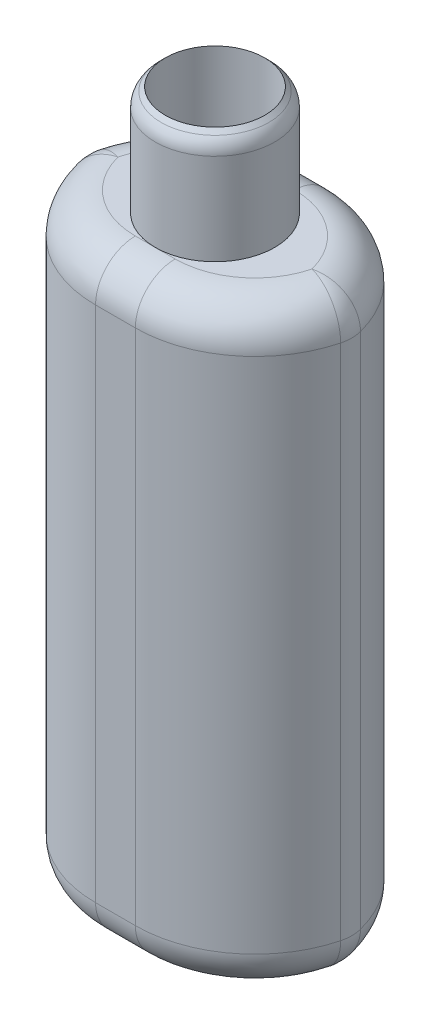
ISO-10303-21;
HEADER;
FILE_DESCRIPTION(('STEP AP214'),'2;1');
FILE_NAME('part.step','',(''),(''),'','','');
FILE_SCHEMA(('AUTOMOTIVE_DESIGN { 1 0 10303 214 1 1 1 1 }'));
ENDSEC;
DATA;
#1=APPLICATION_CONTEXT('core data for automotive mechanical design processes');
#2=APPLICATION_PROTOCOL_DEFINITION('international standard','automotive_design',2000,#1);
#3=PRODUCT_CONTEXT('',#1,'mechanical');
#4=PRODUCT('Part','Part','',(#3));
#5=PRODUCT_RELATED_PRODUCT_CATEGORY('part','',(#4));
#6=PRODUCT_DEFINITION_FORMATION('','',#4);
#7=PRODUCT_DEFINITION_CONTEXT('part definition',#1,'design');
#8=PRODUCT_DEFINITION('design','',#6,#7);
#9=PRODUCT_DEFINITION_SHAPE('','',#8);
#10=(LENGTH_UNIT() NAMED_UNIT(*) SI_UNIT(.MILLI.,.METRE.));
#11=(NAMED_UNIT(*) PLANE_ANGLE_UNIT() SI_UNIT($,.RADIAN.));
#12=(NAMED_UNIT(*) SI_UNIT($,.STERADIAN.) SOLID_ANGLE_UNIT());
#13=UNCERTAINTY_MEASURE_WITH_UNIT(LENGTH_MEASURE(1.E-05),#10,'distance_accuracy_value','');
#14=(GEOMETRIC_REPRESENTATION_CONTEXT(3) GLOBAL_UNCERTAINTY_ASSIGNED_CONTEXT((#13)) GLOBAL_UNIT_ASSIGNED_CONTEXT((#10,
#11,#12)) REPRESENTATION_CONTEXT('',''));
#15=CARTESIAN_POINT('',(0.,0.,0.));
#16=DIRECTION('',(0.,0.,1.));
#17=DIRECTION('',(1.,0.,0.));
#18=AXIS2_PLACEMENT_3D('',#15,#16,#17);
#19=CARTESIAN_POINT('',(-35.,75.,25.));
#20=DIRECTION('',(0.,-1.,0.));
#21=DIRECTION('',(0.,0.,-1.));
#22=AXIS2_PLACEMENT_3D('',#19,#20,#21);
#23=PLANE('',#22);
#24=CARTESIAN_POINT('',(0.,75.,0.));
#25=DIRECTION('',(0.,1.,0.));
#26=DIRECTION('',(0.,0.,1.));
#27=AXIS2_PLACEMENT_3D('',#24,#25,#26);
#28=CIRCLE('',#27,15.);
#29=CARTESIAN_POINT('',(0.,75.,-15.));
#30=VERTEX_POINT('',#29);
#31=CARTESIAN_POINT('',(0.,75.,15.));
#32=VERTEX_POINT('',#31);
#33=EDGE_CURVE('E174',#30,#32,#28,.T.);
#34=ORIENTED_EDGE('',*,*,#33,.F.);
#35=DIRECTION('',(-1.,0.,0.));
#36=VECTOR('',#35,1.);
#37=CARTESIAN_POINT('',(-35.,75.,-15.));
#38=LINE('',#37,#36);
#39=CARTESIAN_POINT('',(-5.00000000000002,75.,-15.));
#40=VERTEX_POINT('',#39);
#41=EDGE_CURVE('E160',#30,#40,#38,.T.);
#42=ORIENTED_EDGE('',*,*,#41,.T.);
#43=CARTESIAN_POINT('',(-5.00000000000002,75.,5.));
#44=DIRECTION('',(0.,-1.,0.));
#45=DIRECTION('',(0.,0.,-1.));
#46=AXIS2_PLACEMENT_3D('',#43,#44,#45);
#47=CIRCLE('',#46,20.);
#48=CARTESIAN_POINT('',(-24.3649167310371,75.,0.));
#49=VERTEX_POINT('',#48);
#50=EDGE_CURVE('E171',#40,#49,#47,.F.);
#51=ORIENTED_EDGE('',*,*,#50,.T.);
#52=CARTESIAN_POINT('',(-5.00000000000002,75.,-5.));
#53=DIRECTION('',(0.,-1.,0.));
#54=DIRECTION('',(0.,0.,-1.));
#55=AXIS2_PLACEMENT_3D('',#52,#53,#54);
#56=CIRCLE('',#55,20.);
#57=CARTESIAN_POINT('',(-5.00000000000002,75.,15.));
#58=VERTEX_POINT('',#57);
#59=EDGE_CURVE('E224',#49,#58,#56,.F.);
#60=ORIENTED_EDGE('',*,*,#59,.T.);
#61=DIRECTION('',(-1.,0.,0.));
#62=VECTOR('',#61,1.);
#63=CARTESIAN_POINT('',(4.99999999999999,75.,15.));
#64=LINE('',#63,#62);
#65=EDGE_CURVE('E176',#58,#32,#64,.F.);
#66=ORIENTED_EDGE('',*,*,#65,.T.);
#67=EDGE_LOOP('',(#34,#42,#51,#60,#66));
#68=FACE_BOUND('',#67,.T.);
#69=ADVANCED_FACE('F43',(#68),#23,.F.);
#70=EDGE_CURVE('E59',#32,#30,#28,.T.);
#71=ORIENTED_EDGE('',*,*,#70,.F.);
#72=CARTESIAN_POINT('',(4.99999999999999,75.,15.));
#73=VERTEX_POINT('',#72);
#74=EDGE_CURVE('E227',#32,#73,#64,.F.);
#75=ORIENTED_EDGE('',*,*,#74,.T.);
#76=CARTESIAN_POINT('',(4.99999999999999,75.,-5.));
#77=DIRECTION('',(0.,-1.,0.));
#78=DIRECTION('',(0.,0.,-1.));
#79=AXIS2_PLACEMENT_3D('',#76,#77,#78);
#80=CIRCLE('',#79,20.);
#81=CARTESIAN_POINT('',(24.3649167310371,75.,0.));
#82=VERTEX_POINT('',#81);
#83=EDGE_CURVE('E230',#73,#82,#80,.F.);
#84=ORIENTED_EDGE('',*,*,#83,.T.);
#85=CARTESIAN_POINT('',(4.99999999999999,75.,5.));
#86=DIRECTION('',(0.,-1.,0.));
#87=DIRECTION('',(0.,0.,-1.));
#88=AXIS2_PLACEMENT_3D('',#85,#86,#87);
#89=CIRCLE('',#88,20.);
#90=CARTESIAN_POINT('',(4.99999999999999,75.,-15.));
#91=VERTEX_POINT('',#90);
#92=EDGE_CURVE('E155',#82,#91,#89,.F.);
#93=ORIENTED_EDGE('',*,*,#92,.T.);
#94=EDGE_CURVE('E150',#91,#30,#38,.T.);
#95=ORIENTED_EDGE('',*,*,#94,.T.);
#96=EDGE_LOOP('',(#71,#75,#84,#93,#95));
#97=FACE_BOUND('',#96,.T.);
#98=ADVANCED_FACE('F152',(#97),#23,.F.);
#99=CARTESIAN_POINT('',(-35.,-75.,25.));
#100=DIRECTION('',(0.,1.,0.));
#101=DIRECTION('',(0.,0.,1.));
#102=AXIS2_PLACEMENT_3D('',#99,#100,#101);
#103=PLANE('',#102);
#104=CARTESIAN_POINT('',(-5.,-75.,-5.));
#105=DIRECTION('',(0.,1.,0.));
#106=DIRECTION('',(0.,0.,1.));
#107=AXIS2_PLACEMENT_3D('',#104,#105,#106);
#108=CIRCLE('',#107,20.);
#109=CARTESIAN_POINT('',(-5.,-75.,15.));
#110=VERTEX_POINT('',#109);
#111=CARTESIAN_POINT('',(-24.3649167310371,-75.,0.));
#112=VERTEX_POINT('',#111);
#113=EDGE_CURVE('E214',#110,#112,#108,.F.);
#114=ORIENTED_EDGE('',*,*,#113,.T.);
#115=CARTESIAN_POINT('',(-5.,-75.,5.));
#116=DIRECTION('',(0.,1.,0.));
#117=DIRECTION('',(0.,0.,1.));
#118=AXIS2_PLACEMENT_3D('',#115,#116,#117);
#119=CIRCLE('',#118,20.);
#120=CARTESIAN_POINT('',(-5.,-75.,-15.));
#121=VERTEX_POINT('',#120);
#122=EDGE_CURVE('E67',#112,#121,#119,.F.);
#123=ORIENTED_EDGE('',*,*,#122,.T.);
#124=DIRECTION('',(1.,0.,0.));
#125=VECTOR('',#124,1.);
#126=CARTESIAN_POINT('',(-35.,-75.,-15.));
#127=LINE('',#126,#125);
#128=CARTESIAN_POINT('',(5.,-75.,-15.));
#129=VERTEX_POINT('',#128);
#130=EDGE_CURVE('E325',#121,#129,#127,.T.);
#131=ORIENTED_EDGE('',*,*,#130,.T.);
#132=CARTESIAN_POINT('',(5.,-75.,5.));
#133=DIRECTION('',(0.,1.,0.));
#134=DIRECTION('',(0.,0.,1.));
#135=AXIS2_PLACEMENT_3D('',#132,#133,#134);
#136=CIRCLE('',#135,20.);
#137=CARTESIAN_POINT('',(24.3649167310371,-75.,0.));
#138=VERTEX_POINT('',#137);
#139=EDGE_CURVE('E322',#129,#138,#136,.F.);
#140=ORIENTED_EDGE('',*,*,#139,.T.);
#141=CARTESIAN_POINT('',(5.,-75.,-5.));
#142=DIRECTION('',(0.,1.,0.));
#143=DIRECTION('',(0.,0.,1.));
#144=AXIS2_PLACEMENT_3D('',#141,#142,#143);
#145=CIRCLE('',#144,20.);
#146=CARTESIAN_POINT('',(5.,-75.,15.));
#147=VERTEX_POINT('',#146);
#148=EDGE_CURVE('E221',#138,#147,#145,.F.);
#149=ORIENTED_EDGE('',*,*,#148,.T.);
#150=DIRECTION('',(1.,0.,0.));
#151=VECTOR('',#150,1.);
#152=CARTESIAN_POINT('',(-5.,-75.,15.));
#153=LINE('',#152,#151);
#154=EDGE_CURVE('E217',#147,#110,#153,.F.);
#155=ORIENTED_EDGE('',*,*,#154,.T.);
#156=EDGE_LOOP('',(#114,#123,#131,#140,#149,#155));
#157=FACE_BOUND('',#156,.T.);
#158=ADVANCED_FACE('F378',(#157),#103,.F.);
#159=CARTESIAN_POINT('',(0.,0.,25.));
#160=DIRECTION('',(0.,0.,1.));
#161=DIRECTION('',(1.,0.,0.));
#162=AXIS2_PLACEMENT_3D('',#159,#160,#161);
#163=PLANE('',#162);
#164=DIRECTION('',(0.,-1.,0.));
#165=VECTOR('',#164,1.);
#166=CARTESIAN_POINT('',(-5.,-75.,25.));
#167=LINE('',#166,#165);
#168=CARTESIAN_POINT('',(-5.00000000000002,65.,25.));
#169=VERTEX_POINT('',#168);
#170=CARTESIAN_POINT('',(-5.,-65.,25.));
#171=VERTEX_POINT('',#170);
#172=EDGE_CURVE('E199',#169,#171,#167,.T.);
#173=ORIENTED_EDGE('',*,*,#172,.T.);
#174=DIRECTION('',(1.,0.,0.));
#175=VECTOR('',#174,1.);
#176=CARTESIAN_POINT('',(5.,-65.,25.));
#177=LINE('',#176,#175);
#178=CARTESIAN_POINT('',(5.,-65.,25.));
#179=VERTEX_POINT('',#178);
#180=EDGE_CURVE('E210',#171,#179,#177,.T.);
#181=ORIENTED_EDGE('',*,*,#180,.T.);
#182=DIRECTION('',(0.,1.,0.));
#183=VECTOR('',#182,1.);
#184=CARTESIAN_POINT('',(4.99999999999999,75.,25.));
#185=LINE('',#184,#183);
#186=CARTESIAN_POINT('',(4.99999999999999,65.,25.));
#187=VERTEX_POINT('',#186);
#188=EDGE_CURVE('E203',#179,#187,#185,.T.);
#189=ORIENTED_EDGE('',*,*,#188,.T.);
#190=DIRECTION('',(-1.,0.,0.));
#191=VECTOR('',#190,1.);
#192=CARTESIAN_POINT('',(-5.00000000000002,65.,25.));
#193=LINE('',#192,#191);
#194=EDGE_CURVE('E207',#187,#169,#193,.T.);
#195=ORIENTED_EDGE('',*,*,#194,.T.);
#196=EDGE_LOOP('',(#173,#181,#189,#195));
#197=FACE_BOUND('',#196,.T.);
#198=ADVANCED_FACE('F506',(#197),#163,.T.);
#199=CARTESIAN_POINT('',(0.,0.,-25.));
#200=DIRECTION('',(0.,0.,1.));
#201=DIRECTION('',(1.,0.,0.));
#202=AXIS2_PLACEMENT_3D('',#199,#200,#201);
#203=PLANE('',#202);
#204=DIRECTION('',(0.,-1.,0.));
#205=VECTOR('',#204,1.);
#206=CARTESIAN_POINT('',(-5.00000000000001,0.,-25.));
#207=LINE('',#206,#205);
#208=CARTESIAN_POINT('',(-5.,-65.,-25.));
#209=VERTEX_POINT('',#208);
#210=CARTESIAN_POINT('',(-5.00000000000002,65.,-25.));
#211=VERTEX_POINT('',#210);
#212=EDGE_CURVE('E194',#209,#211,#207,.F.);
#213=ORIENTED_EDGE('',*,*,#212,.T.);
#214=DIRECTION('',(-1.,0.,0.));
#215=VECTOR('',#214,1.);
#216=CARTESIAN_POINT('',(0.,65.,-25.));
#217=LINE('',#216,#215);
#218=CARTESIAN_POINT('',(4.99999999999999,65.,-25.));
#219=VERTEX_POINT('',#218);
#220=EDGE_CURVE('E313',#211,#219,#217,.F.);
#221=ORIENTED_EDGE('',*,*,#220,.T.);
#222=DIRECTION('',(0.,1.,0.));
#223=VECTOR('',#222,1.);
#224=CARTESIAN_POINT('',(5.,0.,-25.));
#225=LINE('',#224,#223);
#226=CARTESIAN_POINT('',(5.,-65.,-25.));
#227=VERTEX_POINT('',#226);
#228=EDGE_CURVE('E190',#219,#227,#225,.F.);
#229=ORIENTED_EDGE('',*,*,#228,.T.);
#230=DIRECTION('',(1.,0.,0.));
#231=VECTOR('',#230,1.);
#232=CARTESIAN_POINT('',(0.,-65.,-25.));
#233=LINE('',#232,#231);
#234=EDGE_CURVE('E310',#227,#209,#233,.F.);
#235=ORIENTED_EDGE('',*,*,#234,.T.);
#236=EDGE_LOOP('',(#213,#221,#229,#235));
#237=FACE_BOUND('',#236,.T.);
#238=ADVANCED_FACE('F390',(#237),#203,.F.);
#239=CARTESIAN_POINT('',(-5.00000000000001,0.,-5.));
#240=DIRECTION('',(0.,1.,0.));
#241=DIRECTION('',(-1.,0.,0.));
#242=AXIS2_PLACEMENT_3D('',#239,#240,#241);
#243=CYLINDRICAL_SURFACE('',#242,30.);
#244=DIRECTION('',(0.,1.,0.));
#245=VECTOR('',#244,1.);
#246=CARTESIAN_POINT('',(-34.0473750965556,0.,2.5));
#247=LINE('',#246,#245);
#248=CARTESIAN_POINT('',(-34.0473750965556,65.,2.5));
#249=VERTEX_POINT('',#248);
#250=CARTESIAN_POINT('',(-34.0473750965556,-65.,2.5));
#251=VERTEX_POINT('',#250);
#252=EDGE_CURVE('E256',#249,#251,#247,.F.);
#253=ORIENTED_EDGE('',*,*,#252,.T.);
#254=CARTESIAN_POINT('',(-5.,-65.,-5.));
#255=DIRECTION('',(0.,1.,0.));
#256=DIRECTION('',(0.,0.,1.));
#257=AXIS2_PLACEMENT_3D('',#254,#255,#256);
#258=CIRCLE('',#257,30.);
#259=EDGE_CURVE('E260',#251,#171,#258,.T.);
#260=ORIENTED_EDGE('',*,*,#259,.T.);
#261=ORIENTED_EDGE('',*,*,#172,.F.);
#262=CARTESIAN_POINT('',(-5.00000000000002,65.,-5.));
#263=DIRECTION('',(0.,-1.,0.));
#264=DIRECTION('',(0.,0.,-1.));
#265=AXIS2_PLACEMENT_3D('',#262,#263,#264);
#266=CIRCLE('',#265,30.);
#267=EDGE_CURVE('E252',#169,#249,#266,.T.);
#268=ORIENTED_EDGE('',*,*,#267,.T.);
#269=EDGE_LOOP('',(#253,#260,#261,#268));
#270=FACE_BOUND('',#269,.T.);
#271=ADVANCED_FACE('F386',(#270),#243,.T.);
#272=CARTESIAN_POINT('',(-5.00000000000002,75.,5.));
#273=DIRECTION('',(0.,-1.,0.));
#274=DIRECTION('',(1.,0.,0.));
#275=AXIS2_PLACEMENT_3D('',#272,#273,#274);
#276=CYLINDRICAL_SURFACE('',#275,30.);
#277=DIRECTION('',(0.,-1.,0.));
#278=VECTOR('',#277,1.);
#279=CARTESIAN_POINT('',(-34.0473750965556,75.,-2.5));
#280=LINE('',#279,#278);
#281=CARTESIAN_POINT('',(-34.0473750965556,-65.,-2.5));
#282=VERTEX_POINT('',#281);
#283=CARTESIAN_POINT('',(-34.0473750965556,65.,-2.5));
#284=VERTEX_POINT('',#283);
#285=EDGE_CURVE('E248',#282,#284,#280,.F.);
#286=ORIENTED_EDGE('',*,*,#285,.T.);
#287=CARTESIAN_POINT('',(-5.00000000000002,65.,5.));
#288=DIRECTION('',(0.,-1.,0.));
#289=DIRECTION('',(0.,0.,-1.));
#290=AXIS2_PLACEMENT_3D('',#287,#288,#289);
#291=CIRCLE('',#290,30.);
#292=EDGE_CURVE('E307',#284,#211,#291,.T.);
#293=ORIENTED_EDGE('',*,*,#292,.T.);
#294=ORIENTED_EDGE('',*,*,#212,.F.);
#295=CARTESIAN_POINT('',(-5.,-65.,5.));
#296=DIRECTION('',(0.,1.,0.));
#297=DIRECTION('',(0.,0.,1.));
#298=AXIS2_PLACEMENT_3D('',#295,#296,#297);
#299=CIRCLE('',#298,30.);
#300=EDGE_CURVE('E304',#209,#282,#299,.T.);
#301=ORIENTED_EDGE('',*,*,#300,.T.);
#302=EDGE_LOOP('',(#286,#293,#294,#301));
#303=FACE_BOUND('',#302,.T.);
#304=ADVANCED_FACE('F382',(#303),#276,.T.);
#305=CARTESIAN_POINT('',(5.,0.,-5.));
#306=DIRECTION('',(0.,-1.,0.));
#307=DIRECTION('',(1.,0.,0.));
#308=AXIS2_PLACEMENT_3D('',#305,#306,#307);
#309=CYLINDRICAL_SURFACE('',#308,30.);
#310=DIRECTION('',(0.,-1.,0.));
#311=VECTOR('',#310,1.);
#312=CARTESIAN_POINT('',(34.0473750965556,0.,2.5));
#313=LINE('',#312,#311);
#314=CARTESIAN_POINT('',(34.0473750965556,-65.,2.5));
#315=VERTEX_POINT('',#314);
#316=CARTESIAN_POINT('',(34.0473750965556,65.,2.5));
#317=VERTEX_POINT('',#316);
#318=EDGE_CURVE('E241',#315,#317,#313,.F.);
#319=ORIENTED_EDGE('',*,*,#318,.T.);
#320=CARTESIAN_POINT('',(4.99999999999999,65.,-5.));
#321=DIRECTION('',(0.,-1.,0.));
#322=DIRECTION('',(0.,0.,-1.));
#323=AXIS2_PLACEMENT_3D('',#320,#321,#322);
#324=CIRCLE('',#323,30.);
#325=EDGE_CURVE('E245',#317,#187,#324,.T.);
#326=ORIENTED_EDGE('',*,*,#325,.T.);
#327=ORIENTED_EDGE('',*,*,#188,.F.);
#328=CARTESIAN_POINT('',(5.,-65.,-5.));
#329=DIRECTION('',(0.,1.,0.));
#330=DIRECTION('',(0.,0.,1.));
#331=AXIS2_PLACEMENT_3D('',#328,#329,#330);
#332=CIRCLE('',#331,30.);
#333=EDGE_CURVE('E237',#179,#315,#332,.T.);
#334=ORIENTED_EDGE('',*,*,#333,.T.);
#335=EDGE_LOOP('',(#319,#326,#327,#334));
#336=FACE_BOUND('',#335,.T.);
#337=ADVANCED_FACE('F385',(#336),#309,.T.);
#338=CARTESIAN_POINT('',(4.99999999999999,75.,5.));
#339=DIRECTION('',(0.,1.,0.));
#340=DIRECTION('',(-1.,0.,0.));
#341=AXIS2_PLACEMENT_3D('',#338,#339,#340);
#342=CYLINDRICAL_SURFACE('',#341,30.);
#343=ORIENTED_EDGE('',*,*,#228,.F.);
#344=CARTESIAN_POINT('',(4.99999999999999,65.,5.));
#345=DIRECTION('',(0.,-1.,0.));
#346=DIRECTION('',(0.,0.,-1.));
#347=AXIS2_PLACEMENT_3D('',#344,#345,#346);
#348=CIRCLE('',#347,30.);
#349=CARTESIAN_POINT('',(34.0473750965556,65.,-2.5));
#350=VERTEX_POINT('',#349);
#351=EDGE_CURVE('E319',#219,#350,#348,.T.);
#352=ORIENTED_EDGE('',*,*,#351,.T.);
#353=DIRECTION('',(0.,1.,0.));
#354=VECTOR('',#353,1.);
#355=CARTESIAN_POINT('',(34.0473750965556,75.,-2.5));
#356=LINE('',#355,#354);
#357=CARTESIAN_POINT('',(34.0473750965556,-65.,-2.5));
#358=VERTEX_POINT('',#357);
#359=EDGE_CURVE('E233',#350,#358,#356,.F.);
#360=ORIENTED_EDGE('',*,*,#359,.T.);
#361=CARTESIAN_POINT('',(5.,-65.,5.));
#362=DIRECTION('',(0.,1.,0.));
#363=DIRECTION('',(0.,0.,1.));
#364=AXIS2_PLACEMENT_3D('',#361,#362,#363);
#365=CIRCLE('',#364,30.);
#366=EDGE_CURVE('E316',#358,#227,#365,.T.);
#367=ORIENTED_EDGE('',*,*,#366,.T.);
#368=EDGE_LOOP('',(#343,#352,#360,#367));
#369=FACE_BOUND('',#368,.T.);
#370=ADVANCED_FACE('F392',(#369),#342,.T.);
#371=CARTESIAN_POINT('',(0.,65.,15.));
#372=DIRECTION('',(1.,0.,0.));
#373=DIRECTION('',(0.,0.,-1.));
#374=AXIS2_PLACEMENT_3D('',#371,#372,#373);
#375=CYLINDRICAL_SURFACE('',#374,10.);
#376=CARTESIAN_POINT('',(4.99999999999999,65.,15.));
#377=DIRECTION('',(1.,0.,0.));
#378=DIRECTION('',(0.,0.,-1.));
#379=AXIS2_PLACEMENT_3D('',#376,#377,#378);
#380=CIRCLE('',#379,10.);
#381=EDGE_CURVE('E271',#73,#187,#380,.T.);
#382=ORIENTED_EDGE('',*,*,#381,.F.);
#383=ORIENTED_EDGE('',*,*,#74,.F.);
#384=ORIENTED_EDGE('',*,*,#65,.F.);
#385=CARTESIAN_POINT('',(-5.00000000000002,65.,15.));
#386=DIRECTION('',(-1.,0.,0.));
#387=DIRECTION('',(0.,0.,1.));
#388=AXIS2_PLACEMENT_3D('',#385,#386,#387);
#389=CIRCLE('',#388,10.);
#390=EDGE_CURVE('E195',#169,#58,#389,.T.);
#391=ORIENTED_EDGE('',*,*,#390,.F.);
#392=ORIENTED_EDGE('',*,*,#194,.F.);
#393=EDGE_LOOP('',(#382,#383,#384,#391,#392));
#394=FACE_BOUND('',#393,.T.);
#395=ADVANCED_FACE('F395',(#394),#375,.T.);
#396=CARTESIAN_POINT('',(-5.00000000000002,65.,-5.));
#397=DIRECTION('',(0.,-1.,0.));
#398=DIRECTION('',(0.,0.,-1.));
#399=AXIS2_PLACEMENT_3D('',#396,#397,#398);
#400=TOROIDAL_SURFACE('',#399,20.,10.);
#401=ORIENTED_EDGE('',*,*,#59,.F.);
#402=CARTESIAN_POINT('',(-24.3649167310371,65.,0.));
#403=DIRECTION('',(-0.25,0.,-0.968245836551854));
#404=DIRECTION('',(-0.968245836551854,0.,0.25));
#405=AXIS2_PLACEMENT_3D('',#402,#403,#404);
#406=CIRCLE('',#405,10.);
#407=EDGE_CURVE('E297',#49,#249,#406,.F.);
#408=ORIENTED_EDGE('',*,*,#407,.T.);
#409=ORIENTED_EDGE('',*,*,#267,.F.);
#410=ORIENTED_EDGE('',*,*,#390,.T.);
#411=EDGE_LOOP('',(#401,#408,#409,#410));
#412=FACE_BOUND('',#411,.T.);
#413=ADVANCED_FACE('F424',(#412),#400,.T.);
#414=CARTESIAN_POINT('',(4.99999999999999,65.,-5.));
#415=DIRECTION('',(0.,-1.,0.));
#416=DIRECTION('',(0.,0.,-1.));
#417=AXIS2_PLACEMENT_3D('',#414,#415,#416);
#418=TOROIDAL_SURFACE('',#417,20.,10.);
#419=ORIENTED_EDGE('',*,*,#325,.F.);
#420=CARTESIAN_POINT('',(24.3649167310371,65.,0.));
#421=DIRECTION('',(-0.25,0.,0.968245836551854));
#422=DIRECTION('',(0.968245836551854,0.,0.25));
#423=AXIS2_PLACEMENT_3D('',#420,#421,#422);
#424=CIRCLE('',#423,10.);
#425=EDGE_CURVE('E288',#317,#82,#424,.T.);
#426=ORIENTED_EDGE('',*,*,#425,.T.);
#427=ORIENTED_EDGE('',*,*,#83,.F.);
#428=ORIENTED_EDGE('',*,*,#381,.T.);
#429=EDGE_LOOP('',(#419,#426,#427,#428));
#430=FACE_BOUND('',#429,.T.);
#431=ADVANCED_FACE('F417',(#430),#418,.T.);
#432=CARTESIAN_POINT('',(-24.3649167310371,0.,0.));
#433=DIRECTION('',(0.,1.,0.));
#434=DIRECTION('',(-1.,0.,0.));
#435=AXIS2_PLACEMENT_3D('',#432,#433,#434);
#436=CYLINDRICAL_SURFACE('',#435,10.);
#437=ORIENTED_EDGE('',*,*,#252,.F.);
#438=CARTESIAN_POINT('',(-24.3649167310371,65.,0.));
#439=DIRECTION('',(0.,1.,0.));
#440=DIRECTION('',(-1.,0.,0.));
#441=AXIS2_PLACEMENT_3D('',#438,#439,#440);
#442=CIRCLE('',#441,10.);
#443=EDGE_CURVE('E294',#249,#284,#442,.F.);
#444=ORIENTED_EDGE('',*,*,#443,.T.);
#445=ORIENTED_EDGE('',*,*,#285,.F.);
#446=CARTESIAN_POINT('',(-24.3649167310371,-65.,0.));
#447=DIRECTION('',(0.,1.,0.));
#448=DIRECTION('',(-1.,0.,0.));
#449=AXIS2_PLACEMENT_3D('',#446,#447,#448);
#450=CIRCLE('',#449,10.);
#451=EDGE_CURVE('E291',#282,#251,#450,.T.);
#452=ORIENTED_EDGE('',*,*,#451,.T.);
#453=EDGE_LOOP('',(#437,#444,#445,#452));
#454=FACE_BOUND('',#453,.T.);
#455=ADVANCED_FACE('F413',(#454),#436,.T.);
#456=CARTESIAN_POINT('',(24.3649167310371,0.,0.));
#457=DIRECTION('',(0.,-1.,0.));
#458=DIRECTION('',(1.,0.,0.));
#459=AXIS2_PLACEMENT_3D('',#456,#457,#458);
#460=CYLINDRICAL_SURFACE('',#459,10.);
#461=ORIENTED_EDGE('',*,*,#318,.F.);
#462=CARTESIAN_POINT('',(24.3649167310371,-65.,0.));
#463=DIRECTION('',(0.,-1.,0.));
#464=DIRECTION('',(1.,0.,0.));
#465=AXIS2_PLACEMENT_3D('',#462,#463,#464);
#466=CIRCLE('',#465,10.);
#467=EDGE_CURVE('E285',#315,#358,#466,.F.);
#468=ORIENTED_EDGE('',*,*,#467,.T.);
#469=ORIENTED_EDGE('',*,*,#359,.F.);
#470=CARTESIAN_POINT('',(24.3649167310371,65.,0.));
#471=DIRECTION('',(0.,-1.,0.));
#472=DIRECTION('',(1.,0.,0.));
#473=AXIS2_PLACEMENT_3D('',#470,#471,#472);
#474=CIRCLE('',#473,10.);
#475=EDGE_CURVE('E281',#350,#317,#474,.T.);
#476=ORIENTED_EDGE('',*,*,#475,.T.);
#477=EDGE_LOOP('',(#461,#468,#469,#476));
#478=FACE_BOUND('',#477,.T.);
#479=ADVANCED_FACE('F410',(#478),#460,.T.);
#480=CARTESIAN_POINT('',(-5.,-65.,-5.));
#481=DIRECTION('',(0.,1.,0.));
#482=DIRECTION('',(0.,0.,1.));
#483=AXIS2_PLACEMENT_3D('',#480,#481,#482);
#484=TOROIDAL_SURFACE('',#483,20.,10.);
#485=ORIENTED_EDGE('',*,*,#259,.F.);
#486=CARTESIAN_POINT('',(-24.3649167310371,-65.,0.));
#487=DIRECTION('',(0.25,0.,0.968245836551854));
#488=DIRECTION('',(0.968245836551854,0.,-0.25));
#489=AXIS2_PLACEMENT_3D('',#486,#487,#488);
#490=CIRCLE('',#489,10.);
#491=EDGE_CURVE('E330',#251,#112,#490,.T.);
#492=ORIENTED_EDGE('',*,*,#491,.T.);
#493=ORIENTED_EDGE('',*,*,#113,.F.);
#494=CARTESIAN_POINT('',(-5.,-65.,15.));
#495=DIRECTION('',(1.,0.,0.));
#496=DIRECTION('',(0.,0.,-1.));
#497=AXIS2_PLACEMENT_3D('',#494,#495,#496);
#498=CIRCLE('',#497,10.);
#499=EDGE_CURVE('E267',#171,#110,#498,.T.);
#500=ORIENTED_EDGE('',*,*,#499,.F.);
#501=EDGE_LOOP('',(#485,#492,#493,#500));
#502=FACE_BOUND('',#501,.T.);
#503=ADVANCED_FACE('F408',(#502),#484,.T.);
#504=CARTESIAN_POINT('',(5.,-65.,-5.));
#505=DIRECTION('',(0.,1.,0.));
#506=DIRECTION('',(0.,0.,1.));
#507=AXIS2_PLACEMENT_3D('',#504,#505,#506);
#508=TOROIDAL_SURFACE('',#507,20.,10.);
#509=ORIENTED_EDGE('',*,*,#148,.F.);
#510=CARTESIAN_POINT('',(24.3649167310371,-65.,0.));
#511=DIRECTION('',(0.25,0.,-0.968245836551854));
#512=DIRECTION('',(-0.968245836551854,0.,-0.25));
#513=AXIS2_PLACEMENT_3D('',#510,#511,#512);
#514=CIRCLE('',#513,10.);
#515=EDGE_CURVE('E263',#138,#315,#514,.F.);
#516=ORIENTED_EDGE('',*,*,#515,.T.);
#517=ORIENTED_EDGE('',*,*,#333,.F.);
#518=CARTESIAN_POINT('',(5.,-65.,15.));
#519=DIRECTION('',(-1.,0.,0.));
#520=DIRECTION('',(0.,0.,1.));
#521=AXIS2_PLACEMENT_3D('',#518,#519,#520);
#522=CIRCLE('',#521,10.);
#523=EDGE_CURVE('E264',#147,#179,#522,.T.);
#524=ORIENTED_EDGE('',*,*,#523,.F.);
#525=EDGE_LOOP('',(#509,#516,#517,#524));
#526=FACE_BOUND('',#525,.T.);
#527=ADVANCED_FACE('F404',(#526),#508,.T.);
#528=CARTESIAN_POINT('',(0.,-65.,15.));
#529=DIRECTION('',(-1.,0.,0.));
#530=DIRECTION('',(0.,0.,1.));
#531=AXIS2_PLACEMENT_3D('',#528,#529,#530);
#532=CYLINDRICAL_SURFACE('',#531,10.);
#533=ORIENTED_EDGE('',*,*,#499,.T.);
#534=ORIENTED_EDGE('',*,*,#154,.F.);
#535=ORIENTED_EDGE('',*,*,#523,.T.);
#536=ORIENTED_EDGE('',*,*,#180,.F.);
#537=EDGE_LOOP('',(#533,#534,#535,#536));
#538=FACE_BOUND('',#537,.T.);
#539=ADVANCED_FACE('F400',(#538),#532,.T.);
#540=CARTESIAN_POINT('',(-24.3649167310371,-65.,0.));
#541=DIRECTION('',(0.,0.,1.));
#542=DIRECTION('',(1.,0.,0.));
#543=AXIS2_PLACEMENT_3D('',#540,#541,#542);
#544=SPHERICAL_SURFACE('',#543,10.);
#545=ORIENTED_EDGE('',*,*,#491,.F.);
#546=ORIENTED_EDGE('',*,*,#451,.F.);
#547=CARTESIAN_POINT('',(-24.3649167310371,-65.,0.));
#548=DIRECTION('',(0.25,0.,-0.968245836551854));
#549=DIRECTION('',(-0.968245836551854,0.,-0.25));
#550=AXIS2_PLACEMENT_3D('',#547,#548,#549);
#551=CIRCLE('',#550,10.);
#552=EDGE_CURVE('E268',#112,#282,#551,.T.);
#553=ORIENTED_EDGE('',*,*,#552,.F.);
#554=EDGE_LOOP('',(#545,#546,#553));
#555=FACE_BOUND('',#554,.T.);
#556=ADVANCED_FACE('F403',(#555),#544,.T.);
#557=CARTESIAN_POINT('',(-5.,-65.,5.));
#558=DIRECTION('',(0.,1.,0.));
#559=DIRECTION('',(0.,0.,1.));
#560=AXIS2_PLACEMENT_3D('',#557,#558,#559);
#561=TOROIDAL_SURFACE('',#560,20.,10.);
#562=ORIENTED_EDGE('',*,*,#552,.T.);
#563=ORIENTED_EDGE('',*,*,#300,.F.);
#564=CARTESIAN_POINT('',(-5.,-65.,-15.));
#565=DIRECTION('',(1.,0.,0.));
#566=DIRECTION('',(0.,0.,-1.));
#567=AXIS2_PLACEMENT_3D('',#564,#565,#566);
#568=CIRCLE('',#567,10.);
#569=EDGE_CURVE('E343',#121,#209,#568,.T.);
#570=ORIENTED_EDGE('',*,*,#569,.F.);
#571=ORIENTED_EDGE('',*,*,#122,.F.);
#572=EDGE_LOOP('',(#562,#563,#570,#571));
#573=FACE_BOUND('',#572,.T.);
#574=ADVANCED_FACE('F444',(#573),#561,.T.);
#575=CARTESIAN_POINT('',(-35.,-65.,-15.));
#576=DIRECTION('',(1.,0.,0.));
#577=DIRECTION('',(0.,0.,-1.));
#578=AXIS2_PLACEMENT_3D('',#575,#576,#577);
#579=CYLINDRICAL_SURFACE('',#578,10.);
#580=ORIENTED_EDGE('',*,*,#569,.T.);
#581=ORIENTED_EDGE('',*,*,#234,.F.);
#582=CARTESIAN_POINT('',(5.,-65.,-15.));
#583=DIRECTION('',(1.,0.,0.));
#584=DIRECTION('',(0.,0.,-1.));
#585=AXIS2_PLACEMENT_3D('',#582,#583,#584);
#586=CIRCLE('',#585,10.);
#587=EDGE_CURVE('E338',#129,#227,#586,.T.);
#588=ORIENTED_EDGE('',*,*,#587,.F.);
#589=ORIENTED_EDGE('',*,*,#130,.F.);
#590=EDGE_LOOP('',(#580,#581,#588,#589));
#591=FACE_BOUND('',#590,.T.);
#592=ADVANCED_FACE('F440',(#591),#579,.T.);
#593=CARTESIAN_POINT('',(5.,-65.,5.));
#594=DIRECTION('',(0.,1.,0.));
#595=DIRECTION('',(0.,0.,1.));
#596=AXIS2_PLACEMENT_3D('',#593,#594,#595);
#597=TOROIDAL_SURFACE('',#596,20.,10.);
#598=ORIENTED_EDGE('',*,*,#587,.T.);
#599=ORIENTED_EDGE('',*,*,#366,.F.);
#600=CARTESIAN_POINT('',(24.3649167310371,-65.,0.));
#601=DIRECTION('',(0.25,0.,0.968245836551854));
#602=DIRECTION('',(0.968245836551854,0.,-0.25));
#603=AXIS2_PLACEMENT_3D('',#600,#601,#602);
#604=CIRCLE('',#603,10.);
#605=EDGE_CURVE('E334',#138,#358,#604,.T.);
#606=ORIENTED_EDGE('',*,*,#605,.F.);
#607=ORIENTED_EDGE('',*,*,#139,.F.);
#608=EDGE_LOOP('',(#598,#599,#606,#607));
#609=FACE_BOUND('',#608,.T.);
#610=ADVANCED_FACE('F436',(#609),#597,.T.);
#611=CARTESIAN_POINT('',(24.3649167310371,-65.,0.));
#612=DIRECTION('',(0.,0.,1.));
#613=DIRECTION('',(1.,0.,0.));
#614=AXIS2_PLACEMENT_3D('',#611,#612,#613);
#615=SPHERICAL_SURFACE('',#614,10.);
#616=ORIENTED_EDGE('',*,*,#605,.T.);
#617=ORIENTED_EDGE('',*,*,#467,.F.);
#618=ORIENTED_EDGE('',*,*,#515,.F.);
#619=EDGE_LOOP('',(#616,#617,#618));
#620=FACE_BOUND('',#619,.T.);
#621=ADVANCED_FACE('F432',(#620),#615,.T.);
#622=CARTESIAN_POINT('',(-24.3649167310371,65.,0.));
#623=DIRECTION('',(0.,0.,1.));
#624=DIRECTION('',(1.,0.,0.));
#625=AXIS2_PLACEMENT_3D('',#622,#623,#624);
#626=SPHERICAL_SURFACE('',#625,10.);
#627=ORIENTED_EDGE('',*,*,#443,.F.);
#628=ORIENTED_EDGE('',*,*,#407,.F.);
#629=CARTESIAN_POINT('',(-24.3649167310371,65.,0.));
#630=DIRECTION('',(0.25,0.,-0.968245836551854));
#631=DIRECTION('',(-0.968245836551854,0.,-0.25));
#632=AXIS2_PLACEMENT_3D('',#629,#630,#631);
#633=CIRCLE('',#632,10.);
#634=EDGE_CURVE('E339',#284,#49,#633,.T.);
#635=ORIENTED_EDGE('',*,*,#634,.F.);
#636=EDGE_LOOP('',(#627,#628,#635));
#637=FACE_BOUND('',#636,.T.);
#638=ADVANCED_FACE('F435',(#637),#626,.T.);
#639=CARTESIAN_POINT('',(-5.00000000000002,65.,5.));
#640=DIRECTION('',(0.,-1.,0.));
#641=DIRECTION('',(0.,0.,-1.));
#642=AXIS2_PLACEMENT_3D('',#639,#640,#641);
#643=TOROIDAL_SURFACE('',#642,20.,10.);
#644=ORIENTED_EDGE('',*,*,#634,.T.);
#645=ORIENTED_EDGE('',*,*,#50,.F.);
#646=CARTESIAN_POINT('',(-5.00000000000002,65.,-15.));
#647=DIRECTION('',(1.,0.,0.));
#648=DIRECTION('',(0.,0.,-1.));
#649=AXIS2_PLACEMENT_3D('',#646,#647,#648);
#650=CIRCLE('',#649,10.);
#651=EDGE_CURVE('E167',#211,#40,#650,.T.);
#652=ORIENTED_EDGE('',*,*,#651,.F.);
#653=ORIENTED_EDGE('',*,*,#292,.F.);
#654=EDGE_LOOP('',(#644,#645,#652,#653));
#655=FACE_BOUND('',#654,.T.);
#656=ADVANCED_FACE('F462',(#655),#643,.T.);
#657=CARTESIAN_POINT('',(-35.,65.,-15.));
#658=DIRECTION('',(-1.,0.,0.));
#659=DIRECTION('',(0.,0.,1.));
#660=AXIS2_PLACEMENT_3D('',#657,#658,#659);
#661=CYLINDRICAL_SURFACE('',#660,10.);
#662=ORIENTED_EDGE('',*,*,#651,.T.);
#663=ORIENTED_EDGE('',*,*,#41,.F.);
#664=ORIENTED_EDGE('',*,*,#94,.F.);
#665=CARTESIAN_POINT('',(4.99999999999999,65.,-15.));
#666=DIRECTION('',(1.,0.,0.));
#667=DIRECTION('',(0.,0.,-1.));
#668=AXIS2_PLACEMENT_3D('',#665,#666,#667);
#669=CIRCLE('',#668,10.);
#670=EDGE_CURVE('E186',#219,#91,#669,.T.);
#671=ORIENTED_EDGE('',*,*,#670,.F.);
#672=ORIENTED_EDGE('',*,*,#220,.F.);
#673=EDGE_LOOP('',(#662,#663,#664,#671,#672));
#674=FACE_BOUND('',#673,.T.);
#675=ADVANCED_FACE('F164',(#674),#661,.T.);
#676=CARTESIAN_POINT('',(4.99999999999999,65.,5.));
#677=DIRECTION('',(0.,-1.,0.));
#678=DIRECTION('',(0.,0.,-1.));
#679=AXIS2_PLACEMENT_3D('',#676,#677,#678);
#680=TOROIDAL_SURFACE('',#679,20.,10.);
#681=ORIENTED_EDGE('',*,*,#670,.T.);
#682=ORIENTED_EDGE('',*,*,#92,.F.);
#683=CARTESIAN_POINT('',(24.3649167310371,65.,0.));
#684=DIRECTION('',(0.25,0.,0.968245836551854));
#685=DIRECTION('',(0.968245836551854,0.,-0.25));
#686=AXIS2_PLACEMENT_3D('',#683,#684,#685);
#687=CIRCLE('',#686,10.);
#688=EDGE_CURVE('E183',#350,#82,#687,.T.);
#689=ORIENTED_EDGE('',*,*,#688,.F.);
#690=ORIENTED_EDGE('',*,*,#351,.F.);
#691=EDGE_LOOP('',(#681,#682,#689,#690));
#692=FACE_BOUND('',#691,.T.);
#693=ADVANCED_FACE('F455',(#692),#680,.T.);
#694=CARTESIAN_POINT('',(24.3649167310371,65.,0.));
#695=DIRECTION('',(0.,0.,1.));
#696=DIRECTION('',(1.,0.,0.));
#697=AXIS2_PLACEMENT_3D('',#694,#695,#696);
#698=SPHERICAL_SURFACE('',#697,10.);
#699=ORIENTED_EDGE('',*,*,#688,.T.);
#700=ORIENTED_EDGE('',*,*,#425,.F.);
#701=ORIENTED_EDGE('',*,*,#475,.F.);
#702=EDGE_LOOP('',(#699,#700,#701));
#703=FACE_BOUND('',#702,.T.);
#704=ADVANCED_FACE('F452',(#703),#698,.T.);
#705=CARTESIAN_POINT('',(0.,105.,0.));
#706=DIRECTION('',(0.,-1.,0.));
#707=DIRECTION('',(0.,0.,-1.));
#708=AXIS2_PLACEMENT_3D('',#705,#706,#707);
#709=CYLINDRICAL_SURFACE('',#708,15.);
#710=CARTESIAN_POINT('',(0.,97.9289321881345,0.));
#711=DIRECTION('',(0.,1.,0.));
#712=DIRECTION('',(0.,0.,1.));
#713=AXIS2_PLACEMENT_3D('',#710,#711,#712);
#714=CIRCLE('',#713,15.);
#715=CARTESIAN_POINT('',(0.,97.9289321881345,15.));
#716=VERTEX_POINT('',#715);
#717=EDGE_CURVE('E52',#716,#716,#714,.F.);
#718=ORIENTED_EDGE('',*,*,#717,.T.);
#719=EDGE_LOOP('',(#718));
#720=FACE_BOUND('',#719,.T.);
#721=ORIENTED_EDGE('',*,*,#70,.T.);
#722=ORIENTED_EDGE('',*,*,#33,.T.);
#723=EDGE_LOOP('',(#721,#722));
#724=FACE_BOUND('',#723,.T.);
#725=ADVANCED_FACE('F181',(#720,#724),#709,.T.);
#726=CARTESIAN_POINT('',(0.,-68.0000000000001,0.));
#727=DIRECTION('',(0.,1.,0.));
#728=DIRECTION('',(0.,0.,1.));
#729=AXIS2_PLACEMENT_3D('',#726,#727,#728);
#730=CYLINDRICAL_SURFACE('',#729,12.5);
#731=CARTESIAN_POINT('',(0.,102.5,0.));
#732=DIRECTION('',(0.,-1.,0.));
#733=DIRECTION('',(0.,0.,-1.));
#734=AXIS2_PLACEMENT_3D('',#731,#732,#733);
#735=CIRCLE('',#734,12.5);
#736=CARTESIAN_POINT('',(0.,102.5,-12.5));
#737=VERTEX_POINT('',#736);
#738=EDGE_CURVE('E333',#737,#737,#735,.F.);
#739=ORIENTED_EDGE('',*,*,#738,.T.);
#740=EDGE_LOOP('',(#739));
#741=FACE_BOUND('',#740,.T.);
#742=CARTESIAN_POINT('',(0.,-68.0000000000001,0.));
#743=DIRECTION('',(0.,1.,0.));
#744=DIRECTION('',(0.,0.,1.));
#745=AXIS2_PLACEMENT_3D('',#742,#743,#744);
#746=CIRCLE('',#745,12.5);
#747=CARTESIAN_POINT('',(0.,-68.0000000000001,12.5));
#748=VERTEX_POINT('',#747);
#749=EDGE_CURVE('E179',#748,#748,#746,.T.);
#750=ORIENTED_EDGE('',*,*,#749,.F.);
#751=EDGE_LOOP('',(#750));
#752=FACE_BOUND('',#751,.T.);
#753=ADVANCED_FACE('F522',(#741,#752),#730,.F.);
#754=CARTESIAN_POINT('',(0.,-68.0000000000001,0.));
#755=DIRECTION('',(0.,1.,0.));
#756=DIRECTION('',(0.,0.,1.));
#757=AXIS2_PLACEMENT_3D('',#754,#755,#756);
#758=PLANE('',#757);
#759=ORIENTED_EDGE('',*,*,#749,.T.);
#760=EDGE_LOOP('',(#759));
#761=FACE_BOUND('',#760,.T.);
#762=ADVANCED_FACE('F370',(#761),#758,.T.);
#763=CARTESIAN_POINT('',(0.,105.,0.));
#764=DIRECTION('',(0.,-1.,0.));
#765=DIRECTION('',(0.,0.,-1.));
#766=AXIS2_PLACEMENT_3D('',#763,#764,#765);
#767=CONICAL_SURFACE('',#766,9.99999999999991,0.785398163397454);
#768=CARTESIAN_POINT('',(0.,101.464466094067,0.));
#769=DIRECTION('',(0.,-1.,0.));
#770=DIRECTION('',(0.,0.,-1.));
#771=AXIS2_PLACEMENT_3D('',#768,#769,#770);
#772=CIRCLE('',#771,13.5355339059327);
#773=CARTESIAN_POINT('',(0.,101.464466094067,-13.5355339059327));
#774=VERTEX_POINT('',#773);
#775=EDGE_CURVE('E11',#774,#774,#772,.F.);
#776=ORIENTED_EDGE('',*,*,#775,.T.);
#777=EDGE_LOOP('',(#776));
#778=FACE_BOUND('',#777,.T.);
#779=ORIENTED_EDGE('',*,*,#738,.F.);
#780=EDGE_LOOP('',(#779));
#781=FACE_BOUND('',#780,.T.);
#782=ADVANCED_FACE('F365',(#778,#781),#767,.T.);
#783=CARTESIAN_POINT('',(0.,97.9289321881345,0.));
#784=DIRECTION('',(0.,1.,0.));
#785=DIRECTION('',(0.,0.,1.));
#786=AXIS2_PLACEMENT_3D('',#783,#784,#785);
#787=TOROIDAL_SURFACE('',#786,10.,5.);
#788=ORIENTED_EDGE('',*,*,#775,.F.);
#789=EDGE_LOOP('',(#788));
#790=FACE_BOUND('',#789,.T.);
#791=ORIENTED_EDGE('',*,*,#717,.F.);
#792=EDGE_LOOP('',(#791));
#793=FACE_BOUND('',#792,.T.);
#794=ADVANCED_FACE('F45',(#790,#793),#787,.T.);
#795=CLOSED_SHELL('',(#69,#98,#158,#198,#238,#271,#304,#337,#370,#395,#413,#431,#455,#479,#503,
#527,#539,#556,#574,#592,#610,#621,#638,#656,#675,#693,#704,#725,#753,#762,#782,#794));
#796=MANIFOLD_SOLID_BREP('B2',#795);
#797=ADVANCED_BREP_SHAPE_REPRESENTATION('',(#18,#796),#14);
#798=SHAPE_DEFINITION_REPRESENTATION(#9,#797);
ENDSEC;
END-ISO-10303-21;
